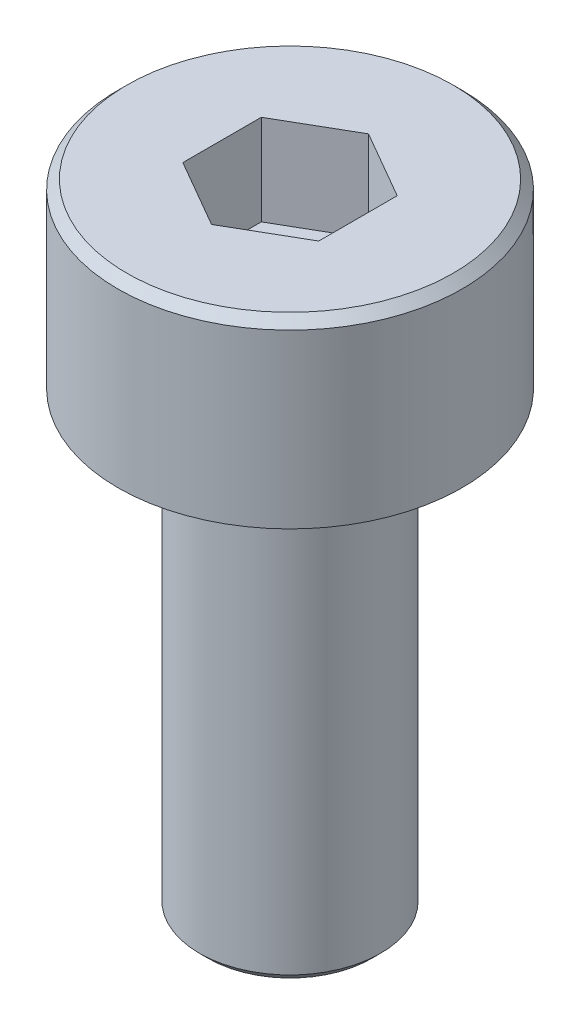
ISO-10303-21;
HEADER;
FILE_DESCRIPTION(('STEP AP214'),'2;1');
FILE_NAME('part.step','',(''),(''),'','','');
FILE_SCHEMA(('AUTOMOTIVE_DESIGN { 1 0 10303 214 1 1 1 1 }'));
ENDSEC;
DATA;
#1=APPLICATION_CONTEXT('core data for automotive mechanical design processes');
#2=APPLICATION_PROTOCOL_DEFINITION('international standard','automotive_design',2000,#1);
#3=PRODUCT_CONTEXT('',#1,'mechanical');
#4=PRODUCT('Part','Part','',(#3));
#5=PRODUCT_RELATED_PRODUCT_CATEGORY('part','',(#4));
#6=PRODUCT_DEFINITION_FORMATION('','',#4);
#7=PRODUCT_DEFINITION_CONTEXT('part definition',#1,'design');
#8=PRODUCT_DEFINITION('design','',#6,#7);
#9=PRODUCT_DEFINITION_SHAPE('','',#8);
#10=(LENGTH_UNIT() NAMED_UNIT(*) SI_UNIT(.MILLI.,.METRE.));
#11=(NAMED_UNIT(*) PLANE_ANGLE_UNIT() SI_UNIT($,.RADIAN.));
#12=(NAMED_UNIT(*) SI_UNIT($,.STERADIAN.) SOLID_ANGLE_UNIT());
#13=UNCERTAINTY_MEASURE_WITH_UNIT(LENGTH_MEASURE(1.E-05),#10,'distance_accuracy_value','');
#14=(GEOMETRIC_REPRESENTATION_CONTEXT(3) GLOBAL_UNCERTAINTY_ASSIGNED_CONTEXT((#13)) GLOBAL_UNIT_ASSIGNED_CONTEXT((#10,
#11,#12)) REPRESENTATION_CONTEXT('',''));
#15=CARTESIAN_POINT('',(0.,0.,0.));
#16=DIRECTION('',(0.,0.,1.));
#17=DIRECTION('',(1.,0.,0.));
#18=AXIS2_PLACEMENT_3D('',#15,#16,#17);
#19=CARTESIAN_POINT('',(1.,-5.,0.));
#20=DIRECTION('',(0.,1.,0.));
#21=DIRECTION('',(0.,0.,1.));
#22=AXIS2_PLACEMENT_3D('',#19,#20,#21);
#23=PLANE('',#22);
#24=CARTESIAN_POINT('',(0.,-5.,0.));
#25=DIRECTION('',(0.,1.,0.));
#26=DIRECTION('',(0.,0.,1.));
#27=AXIS2_PLACEMENT_3D('',#24,#25,#26);
#28=CIRCLE('',#27,0.900000000000017);
#29=CARTESIAN_POINT('',(0.,-5.,0.900000000000017));
#30=VERTEX_POINT('',#29);
#31=EDGE_CURVE('E11',#30,#30,#28,.F.);
#32=ORIENTED_EDGE('',*,*,#31,.T.);
#33=EDGE_LOOP('',(#32));
#34=FACE_BOUND('',#33,.T.);
#35=ADVANCED_FACE('F34',(#34),#23,.F.);
#36=CARTESIAN_POINT('',(0.,2.,0.));
#37=DIRECTION('',(0.,-1.,0.));
#38=DIRECTION('',(0.,0.,-1.));
#39=AXIS2_PLACEMENT_3D('',#36,#37,#38);
#40=PLANE('',#39);
#41=DIRECTION('',(-0.866025403784439,0.,0.5));
#42=VECTOR('',#41,1.);
#43=CARTESIAN_POINT('',(0.,2.,-0.866025403784439));
#44=LINE('',#43,#42);
#45=CARTESIAN_POINT('',(0.,2.,-0.866025403784439));
#46=VERTEX_POINT('',#45);
#47=CARTESIAN_POINT('',(-0.75,2.,-0.43301270189222));
#48=VERTEX_POINT('',#47);
#49=EDGE_CURVE('E123',#46,#48,#44,.T.);
#50=ORIENTED_EDGE('',*,*,#49,.F.);
#51=DIRECTION('',(-0.866025403784439,0.,-0.5));
#52=VECTOR('',#51,1.);
#53=CARTESIAN_POINT('',(0.75,2.,-0.43301270189222));
#54=LINE('',#53,#52);
#55=CARTESIAN_POINT('',(0.75,2.,-0.43301270189222));
#56=VERTEX_POINT('',#55);
#57=EDGE_CURVE('E49',#56,#46,#54,.T.);
#58=ORIENTED_EDGE('',*,*,#57,.F.);
#59=DIRECTION('',(0.,0.,-1.));
#60=VECTOR('',#59,1.);
#61=CARTESIAN_POINT('',(0.75,2.,0.43301270189222));
#62=LINE('',#61,#60);
#63=CARTESIAN_POINT('',(0.75,2.,0.43301270189222));
#64=VERTEX_POINT('',#63);
#65=EDGE_CURVE('E132',#64,#56,#62,.T.);
#66=ORIENTED_EDGE('',*,*,#65,.F.);
#67=DIRECTION('',(0.866025403784439,0.,-0.5));
#68=VECTOR('',#67,1.);
#69=CARTESIAN_POINT('',(0.,2.,0.866025403784439));
#70=LINE('',#69,#68);
#71=CARTESIAN_POINT('',(0.,2.,0.866025403784439));
#72=VERTEX_POINT('',#71);
#73=EDGE_CURVE('E130',#72,#64,#70,.T.);
#74=ORIENTED_EDGE('',*,*,#73,.F.);
#75=DIRECTION('',(0.866025403784438,0.,0.5));
#76=VECTOR('',#75,1.);
#77=CARTESIAN_POINT('',(-0.75,2.,0.433012701892219));
#78=LINE('',#77,#76);
#79=CARTESIAN_POINT('',(-0.75,2.,0.433012701892219));
#80=VERTEX_POINT('',#79);
#81=EDGE_CURVE('E97',#80,#72,#78,.T.);
#82=ORIENTED_EDGE('',*,*,#81,.F.);
#83=DIRECTION('',(0.,0.,1.));
#84=VECTOR('',#83,1.);
#85=CARTESIAN_POINT('',(-0.75,2.,-0.43301270189222));
#86=LINE('',#85,#84);
#87=EDGE_CURVE('E126',#48,#80,#86,.T.);
#88=ORIENTED_EDGE('',*,*,#87,.F.);
#89=EDGE_LOOP('',(#50,#58,#66,#74,#82,#88));
#90=FACE_BOUND('',#89,.T.);
#91=CARTESIAN_POINT('',(0.,2.,0.));
#92=DIRECTION('',(0.,-1.,0.));
#93=DIRECTION('',(0.,0.,-1.));
#94=AXIS2_PLACEMENT_3D('',#91,#92,#93);
#95=CIRCLE('',#94,1.8);
#96=CARTESIAN_POINT('',(0.,2.,-1.8));
#97=VERTEX_POINT('',#96);
#98=EDGE_CURVE('E147',#97,#97,#95,.F.);
#99=ORIENTED_EDGE('',*,*,#98,.T.);
#100=EDGE_LOOP('',(#99));
#101=FACE_BOUND('',#100,.T.);
#102=ADVANCED_FACE('F171',(#90,#101),#40,.F.);
#103=CARTESIAN_POINT('',(0.,28.3884819972091,0.));
#104=DIRECTION('',(0.,1.,0.));
#105=DIRECTION('',(0.,0.,1.));
#106=AXIS2_PLACEMENT_3D('',#103,#104,#105);
#107=CYLINDRICAL_SURFACE('',#106,1.9);
#108=CARTESIAN_POINT('',(0.,1.9,0.));
#109=DIRECTION('',(0.,-1.,0.));
#110=DIRECTION('',(0.,0.,-1.));
#111=AXIS2_PLACEMENT_3D('',#108,#109,#110);
#112=CIRCLE('',#111,1.9);
#113=CARTESIAN_POINT('',(0.,1.9,-1.9));
#114=VERTEX_POINT('',#113);
#115=EDGE_CURVE('E150',#114,#114,#112,.T.);
#116=ORIENTED_EDGE('',*,*,#115,.T.);
#117=EDGE_LOOP('',(#116));
#118=FACE_BOUND('',#117,.T.);
#119=CARTESIAN_POINT('',(0.,0.,0.));
#120=DIRECTION('',(0.,1.,0.));
#121=DIRECTION('',(0.,0.,1.));
#122=AXIS2_PLACEMENT_3D('',#119,#120,#121);
#123=CIRCLE('',#122,1.9);
#124=CARTESIAN_POINT('',(0.,0.,1.9));
#125=VERTEX_POINT('',#124);
#126=EDGE_CURVE('E144',#125,#125,#123,.T.);
#127=ORIENTED_EDGE('',*,*,#126,.T.);
#128=EDGE_LOOP('',(#127));
#129=FACE_BOUND('',#128,.T.);
#130=ADVANCED_FACE('F177',(#118,#129),#107,.T.);
#131=CARTESIAN_POINT('',(1.9,0.,0.));
#132=DIRECTION('',(0.,1.,0.));
#133=DIRECTION('',(0.,0.,1.));
#134=AXIS2_PLACEMENT_3D('',#131,#132,#133);
#135=PLANE('',#134);
#136=ORIENTED_EDGE('',*,*,#126,.F.);
#137=EDGE_LOOP('',(#136));
#138=FACE_BOUND('',#137,.T.);
#139=CARTESIAN_POINT('',(0.,0.,0.));
#140=DIRECTION('',(0.,1.,0.));
#141=DIRECTION('',(0.,0.,1.));
#142=AXIS2_PLACEMENT_3D('',#139,#140,#141);
#143=CIRCLE('',#142,1.);
#144=CARTESIAN_POINT('',(0.,0.,1.));
#145=VERTEX_POINT('',#144);
#146=EDGE_CURVE('E136',#145,#145,#143,.T.);
#147=ORIENTED_EDGE('',*,*,#146,.T.);
#148=EDGE_LOOP('',(#147));
#149=FACE_BOUND('',#148,.T.);
#150=ADVANCED_FACE('F183',(#138,#149),#135,.F.);
#151=CARTESIAN_POINT('',(0.,28.3884819972091,0.));
#152=DIRECTION('',(0.,1.,0.));
#153=DIRECTION('',(0.,0.,1.));
#154=AXIS2_PLACEMENT_3D('',#151,#152,#153);
#155=CYLINDRICAL_SURFACE('',#154,1.);
#156=CARTESIAN_POINT('',(0.,-4.90000000000001,0.));
#157=DIRECTION('',(0.,1.,0.));
#158=DIRECTION('',(0.,0.,1.));
#159=AXIS2_PLACEMENT_3D('',#156,#157,#158);
#160=CIRCLE('',#159,1.);
#161=CARTESIAN_POINT('',(0.,-4.90000000000001,1.));
#162=VERTEX_POINT('',#161);
#163=EDGE_CURVE('E42',#162,#162,#160,.T.);
#164=ORIENTED_EDGE('',*,*,#163,.T.);
#165=EDGE_LOOP('',(#164));
#166=FACE_BOUND('',#165,.T.);
#167=ORIENTED_EDGE('',*,*,#146,.F.);
#168=EDGE_LOOP('',(#167));
#169=FACE_BOUND('',#168,.T.);
#170=ADVANCED_FACE('F155',(#166,#169),#155,.T.);
#171=CARTESIAN_POINT('',(0.,2.,0.));
#172=DIRECTION('',(0.,-1.,0.));
#173=DIRECTION('',(0.,0.,-1.));
#174=AXIS2_PLACEMENT_3D('',#171,#172,#173);
#175=CONICAL_SURFACE('',#174,1.8,0.785398163397457);
#176=ORIENTED_EDGE('',*,*,#115,.F.);
#177=EDGE_LOOP('',(#176));
#178=FACE_BOUND('',#177,.T.);
#179=ORIENTED_EDGE('',*,*,#98,.F.);
#180=EDGE_LOOP('',(#179));
#181=FACE_BOUND('',#180,.T.);
#182=ADVANCED_FACE('F160',(#178,#181),#175,.T.);
#183=CARTESIAN_POINT('',(0.,-4.90000000000001,0.));
#184=DIRECTION('',(0.,1.,0.));
#185=DIRECTION('',(0.,0.,1.));
#186=AXIS2_PLACEMENT_3D('',#183,#184,#185);
#187=CONICAL_SURFACE('',#186,1.,0.78539816339742);
#188=ORIENTED_EDGE('',*,*,#31,.F.);
#189=EDGE_LOOP('',(#188));
#190=FACE_BOUND('',#189,.T.);
#191=ORIENTED_EDGE('',*,*,#163,.F.);
#192=EDGE_LOOP('',(#191));
#193=FACE_BOUND('',#192,.T.);
#194=ADVANCED_FACE('F36',(#190,#193),#187,.T.);
#195=CARTESIAN_POINT('',(0.75,1.,-0.43301270189222));
#196=DIRECTION('',(0.5,0.,-0.866025403784439));
#197=DIRECTION('',(-0.866025403784439,0.,-0.5));
#198=AXIS2_PLACEMENT_3D('',#195,#196,#197);
#199=PLANE('',#198);
#200=ORIENTED_EDGE('',*,*,#57,.T.);
#201=DIRECTION('',(0.,1.,0.));
#202=VECTOR('',#201,1.);
#203=CARTESIAN_POINT('',(0.,1.,-0.866025403784439));
#204=LINE('',#203,#202);
#205=CARTESIAN_POINT('',(0.,1.,-0.866025403784439));
#206=VERTEX_POINT('',#205);
#207=EDGE_CURVE('E79',#206,#46,#204,.T.);
#208=ORIENTED_EDGE('',*,*,#207,.F.);
#209=DIRECTION('',(-0.866025403784439,0.,-0.5));
#210=VECTOR('',#209,1.);
#211=CARTESIAN_POINT('',(0.75,1.,-0.43301270189222));
#212=LINE('',#211,#210);
#213=CARTESIAN_POINT('',(0.75,1.,-0.43301270189222));
#214=VERTEX_POINT('',#213);
#215=EDGE_CURVE('E134',#214,#206,#212,.T.);
#216=ORIENTED_EDGE('',*,*,#215,.F.);
#217=DIRECTION('',(0.,1.,0.));
#218=VECTOR('',#217,1.);
#219=CARTESIAN_POINT('',(0.75,1.,-0.43301270189222));
#220=LINE('',#219,#218);
#221=EDGE_CURVE('E57',#214,#56,#220,.T.);
#222=ORIENTED_EDGE('',*,*,#221,.T.);
#223=EDGE_LOOP('',(#200,#208,#216,#222));
#224=FACE_BOUND('',#223,.T.);
#225=ADVANCED_FACE('F159',(#224),#199,.F.);
#226=CARTESIAN_POINT('',(0.75,1.,0.43301270189222));
#227=DIRECTION('',(1.,0.,0.));
#228=DIRECTION('',(0.,0.,-1.));
#229=AXIS2_PLACEMENT_3D('',#226,#227,#228);
#230=PLANE('',#229);
#231=ORIENTED_EDGE('',*,*,#65,.T.);
#232=ORIENTED_EDGE('',*,*,#221,.F.);
#233=DIRECTION('',(0.,0.,-1.));
#234=VECTOR('',#233,1.);
#235=CARTESIAN_POINT('',(0.75,1.,0.43301270189222));
#236=LINE('',#235,#234);
#237=CARTESIAN_POINT('',(0.75,1.,0.43301270189222));
#238=VERTEX_POINT('',#237);
#239=EDGE_CURVE('E109',#238,#214,#236,.T.);
#240=ORIENTED_EDGE('',*,*,#239,.F.);
#241=DIRECTION('',(0.,1.,0.));
#242=VECTOR('',#241,1.);
#243=CARTESIAN_POINT('',(0.75,1.,0.43301270189222));
#244=LINE('',#243,#242);
#245=EDGE_CURVE('E101',#238,#64,#244,.T.);
#246=ORIENTED_EDGE('',*,*,#245,.T.);
#247=EDGE_LOOP('',(#231,#232,#240,#246));
#248=FACE_BOUND('',#247,.T.);
#249=ADVANCED_FACE('F166',(#248),#230,.F.);
#250=CARTESIAN_POINT('',(0.,1.,0.866025403784439));
#251=DIRECTION('',(0.5,0.,0.866025403784439));
#252=DIRECTION('',(0.866025403784439,0.,-0.5));
#253=AXIS2_PLACEMENT_3D('',#250,#251,#252);
#254=PLANE('',#253);
#255=ORIENTED_EDGE('',*,*,#73,.T.);
#256=ORIENTED_EDGE('',*,*,#245,.F.);
#257=DIRECTION('',(0.866025403784439,0.,-0.5));
#258=VECTOR('',#257,1.);
#259=CARTESIAN_POINT('',(0.,1.,0.866025403784439));
#260=LINE('',#259,#258);
#261=CARTESIAN_POINT('',(0.,1.,0.866025403784439));
#262=VERTEX_POINT('',#261);
#263=EDGE_CURVE('E105',#262,#238,#260,.T.);
#264=ORIENTED_EDGE('',*,*,#263,.F.);
#265=DIRECTION('',(0.,1.,0.));
#266=VECTOR('',#265,1.);
#267=CARTESIAN_POINT('',(0.,1.,0.866025403784439));
#268=LINE('',#267,#266);
#269=EDGE_CURVE('E90',#262,#72,#268,.T.);
#270=ORIENTED_EDGE('',*,*,#269,.T.);
#271=EDGE_LOOP('',(#255,#256,#264,#270));
#272=FACE_BOUND('',#271,.T.);
#273=ADVANCED_FACE('F106',(#272),#254,.F.);
#274=CARTESIAN_POINT('',(-0.75,1.,0.433012701892219));
#275=DIRECTION('',(-0.5,0.,0.866025403784439));
#276=DIRECTION('',(0.866025403784439,0.,0.5));
#277=AXIS2_PLACEMENT_3D('',#274,#275,#276);
#278=PLANE('',#277);
#279=ORIENTED_EDGE('',*,*,#81,.T.);
#280=ORIENTED_EDGE('',*,*,#269,.F.);
#281=DIRECTION('',(0.866025403784438,0.,0.5));
#282=VECTOR('',#281,1.);
#283=CARTESIAN_POINT('',(-0.75,1.,0.433012701892219));
#284=LINE('',#283,#282);
#285=CARTESIAN_POINT('',(-0.75,1.,0.433012701892219));
#286=VERTEX_POINT('',#285);
#287=EDGE_CURVE('E94',#286,#262,#284,.T.);
#288=ORIENTED_EDGE('',*,*,#287,.F.);
#289=DIRECTION('',(0.,1.,0.));
#290=VECTOR('',#289,1.);
#291=CARTESIAN_POINT('',(-0.75,1.,0.433012701892219));
#292=LINE('',#291,#290);
#293=EDGE_CURVE('E102',#286,#80,#292,.T.);
#294=ORIENTED_EDGE('',*,*,#293,.T.);
#295=EDGE_LOOP('',(#279,#280,#288,#294));
#296=FACE_BOUND('',#295,.T.);
#297=ADVANCED_FACE('F92',(#296),#278,.F.);
#298=CARTESIAN_POINT('',(-0.75,1.,-0.43301270189222));
#299=DIRECTION('',(-1.,0.,0.));
#300=DIRECTION('',(0.,0.,1.));
#301=AXIS2_PLACEMENT_3D('',#298,#299,#300);
#302=PLANE('',#301);
#303=ORIENTED_EDGE('',*,*,#87,.T.);
#304=ORIENTED_EDGE('',*,*,#293,.F.);
#305=DIRECTION('',(0.,0.,1.));
#306=VECTOR('',#305,1.);
#307=CARTESIAN_POINT('',(-0.75,1.,-0.43301270189222));
#308=LINE('',#307,#306);
#309=CARTESIAN_POINT('',(-0.75,1.,-0.43301270189222));
#310=VERTEX_POINT('',#309);
#311=EDGE_CURVE('E115',#310,#286,#308,.T.);
#312=ORIENTED_EDGE('',*,*,#311,.F.);
#313=DIRECTION('',(0.,1.,0.));
#314=VECTOR('',#313,1.);
#315=CARTESIAN_POINT('',(-0.75,1.,-0.43301270189222));
#316=LINE('',#315,#314);
#317=EDGE_CURVE('E139',#310,#48,#316,.T.);
#318=ORIENTED_EDGE('',*,*,#317,.T.);
#319=EDGE_LOOP('',(#303,#304,#312,#318));
#320=FACE_BOUND('',#319,.T.);
#321=ADVANCED_FACE('F193',(#320),#302,.F.);
#322=CARTESIAN_POINT('',(0.,1.,-0.866025403784439));
#323=DIRECTION('',(-0.5,0.,-0.866025403784439));
#324=DIRECTION('',(-0.866025403784439,0.,0.5));
#325=AXIS2_PLACEMENT_3D('',#322,#323,#324);
#326=PLANE('',#325);
#327=ORIENTED_EDGE('',*,*,#49,.T.);
#328=ORIENTED_EDGE('',*,*,#317,.F.);
#329=DIRECTION('',(-0.866025403784439,0.,0.5));
#330=VECTOR('',#329,1.);
#331=CARTESIAN_POINT('',(0.,1.,-0.866025403784439));
#332=LINE('',#331,#330);
#333=EDGE_CURVE('E117',#206,#310,#332,.T.);
#334=ORIENTED_EDGE('',*,*,#333,.F.);
#335=ORIENTED_EDGE('',*,*,#207,.T.);
#336=EDGE_LOOP('',(#327,#328,#334,#335));
#337=FACE_BOUND('',#336,.T.);
#338=ADVANCED_FACE('F190',(#337),#326,.F.);
#339=CARTESIAN_POINT('',(0.,1.,-0.866025403784439));
#340=DIRECTION('',(0.,1.,0.));
#341=DIRECTION('',(0.,0.,1.));
#342=AXIS2_PLACEMENT_3D('',#339,#340,#341);
#343=PLANE('',#342);
#344=ORIENTED_EDGE('',*,*,#215,.T.);
#345=ORIENTED_EDGE('',*,*,#333,.T.);
#346=ORIENTED_EDGE('',*,*,#311,.T.);
#347=ORIENTED_EDGE('',*,*,#287,.T.);
#348=ORIENTED_EDGE('',*,*,#263,.T.);
#349=ORIENTED_EDGE('',*,*,#239,.T.);
#350=EDGE_LOOP('',(#344,#345,#346,#347,#348,#349));
#351=FACE_BOUND('',#350,.T.);
#352=ADVANCED_FACE('F112',(#351),#343,.T.);
#353=CLOSED_SHELL('',(#35,#102,#130,#150,#170,#182,#194,#225,#249,#273,#297,#321,#338,#352));
#354=MANIFOLD_SOLID_BREP('B2',#353);
#355=ADVANCED_BREP_SHAPE_REPRESENTATION('',(#18,#354),#14);
#356=SHAPE_DEFINITION_REPRESENTATION(#9,#355);
ENDSEC;
END-ISO-10303-21;
